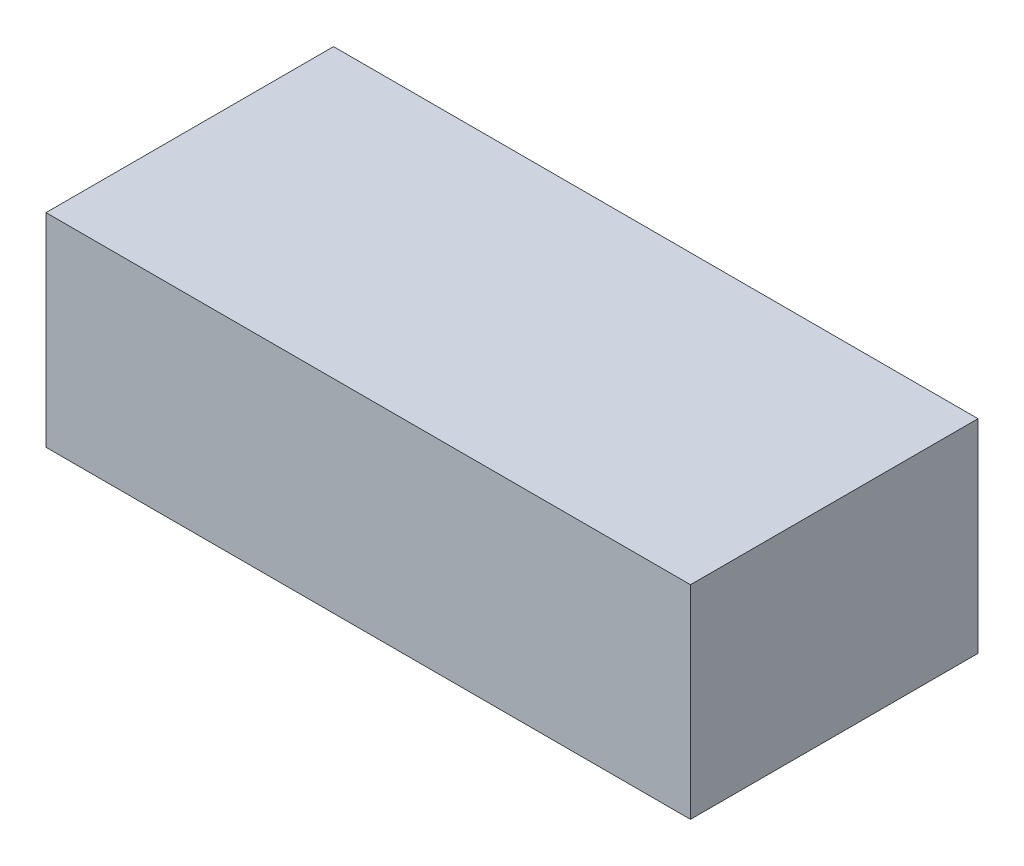
ISO-10303-21;
HEADER;
FILE_DESCRIPTION(('STEP AP214'),'2;1');
FILE_NAME('part.step','',(''),(''),'','','');
FILE_SCHEMA(('AUTOMOTIVE_DESIGN { 1 0 10303 214 1 1 1 1 }'));
ENDSEC;
DATA;
#1=APPLICATION_CONTEXT('core data for automotive mechanical design processes');
#2=APPLICATION_PROTOCOL_DEFINITION('international standard','automotive_design',2000,#1);
#3=PRODUCT_CONTEXT('',#1,'mechanical');
#4=PRODUCT('Part','Part','',(#3));
#5=PRODUCT_RELATED_PRODUCT_CATEGORY('part','',(#4));
#6=PRODUCT_DEFINITION_FORMATION('','',#4);
#7=PRODUCT_DEFINITION_CONTEXT('part definition',#1,'design');
#8=PRODUCT_DEFINITION('design','',#6,#7);
#9=PRODUCT_DEFINITION_SHAPE('','',#8);
#10=(LENGTH_UNIT() NAMED_UNIT(*) SI_UNIT(.MILLI.,.METRE.));
#11=(NAMED_UNIT(*) PLANE_ANGLE_UNIT() SI_UNIT($,.RADIAN.));
#12=(NAMED_UNIT(*) SI_UNIT($,.STERADIAN.) SOLID_ANGLE_UNIT());
#13=UNCERTAINTY_MEASURE_WITH_UNIT(LENGTH_MEASURE(1.E-05),#10,'distance_accuracy_value','');
#14=(GEOMETRIC_REPRESENTATION_CONTEXT(3) GLOBAL_UNCERTAINTY_ASSIGNED_CONTEXT((#13)) GLOBAL_UNIT_ASSIGNED_CONTEXT((#10,
#11,#12)) REPRESENTATION_CONTEXT('',''));
#15=CARTESIAN_POINT('',(0.,0.,0.));
#16=DIRECTION('',(0.,0.,1.));
#17=DIRECTION('',(1.,0.,0.));
#18=AXIS2_PLACEMENT_3D('',#15,#16,#17);
#19=CARTESIAN_POINT('',(32.5,20.5,14.5));
#20=DIRECTION('',(-1.,0.,0.));
#21=DIRECTION('',(0.,0.,1.));
#22=AXIS2_PLACEMENT_3D('',#19,#20,#21);
#23=PLANE('',#22);
#24=DIRECTION('',(0.,0.,-1.));
#25=VECTOR('',#24,1.);
#26=CARTESIAN_POINT('',(32.5,0.,14.5));
#27=LINE('',#26,#25);
#28=CARTESIAN_POINT('',(32.5,0.,14.5));
#29=VERTEX_POINT('',#28);
#30=CARTESIAN_POINT('',(32.5,0.,-14.5));
#31=VERTEX_POINT('',#30);
#32=EDGE_CURVE('E98',#29,#31,#27,.T.);
#33=ORIENTED_EDGE('',*,*,#32,.T.);
#34=DIRECTION('',(0.,-1.,0.));
#35=VECTOR('',#34,1.);
#36=CARTESIAN_POINT('',(32.5,20.5,-14.5));
#37=LINE('',#36,#35);
#38=CARTESIAN_POINT('',(32.5,20.5,-14.5));
#39=VERTEX_POINT('',#38);
#40=EDGE_CURVE('E11',#39,#31,#37,.T.);
#41=ORIENTED_EDGE('',*,*,#40,.F.);
#42=DIRECTION('',(0.,0.,-1.));
#43=VECTOR('',#42,1.);
#44=CARTESIAN_POINT('',(32.5,20.5,14.5));
#45=LINE('',#44,#43);
#46=CARTESIAN_POINT('',(32.5,20.5,14.5));
#47=VERTEX_POINT('',#46);
#48=EDGE_CURVE('E86',#47,#39,#45,.T.);
#49=ORIENTED_EDGE('',*,*,#48,.F.);
#50=DIRECTION('',(0.,-1.,0.));
#51=VECTOR('',#50,1.);
#52=CARTESIAN_POINT('',(32.5,20.5,14.5));
#53=LINE('',#52,#51);
#54=EDGE_CURVE('E94',#47,#29,#53,.T.);
#55=ORIENTED_EDGE('',*,*,#54,.T.);
#56=EDGE_LOOP('',(#33,#41,#49,#55));
#57=FACE_BOUND('',#56,.T.);
#58=ADVANCED_FACE('F35',(#57),#23,.F.);
#59=CARTESIAN_POINT('',(-32.5,20.5,-14.5));
#60=DIRECTION('',(0.,0.,1.));
#61=DIRECTION('',(1.,0.,0.));
#62=AXIS2_PLACEMENT_3D('',#59,#60,#61);
#63=PLANE('',#62);
#64=DIRECTION('',(-1.,0.,0.));
#65=VECTOR('',#64,1.);
#66=CARTESIAN_POINT('',(-32.5,0.,-14.5));
#67=LINE('',#66,#65);
#68=CARTESIAN_POINT('',(-32.5,0.,-14.5));
#69=VERTEX_POINT('',#68);
#70=EDGE_CURVE('E90',#31,#69,#67,.T.);
#71=ORIENTED_EDGE('',*,*,#70,.T.);
#72=DIRECTION('',(0.,-1.,0.));
#73=VECTOR('',#72,1.);
#74=CARTESIAN_POINT('',(-32.5,20.5,-14.5));
#75=LINE('',#74,#73);
#76=CARTESIAN_POINT('',(-32.5,20.5,-14.5));
#77=VERTEX_POINT('',#76);
#78=EDGE_CURVE('E43',#77,#69,#75,.T.);
#79=ORIENTED_EDGE('',*,*,#78,.F.);
#80=DIRECTION('',(-1.,0.,0.));
#81=VECTOR('',#80,1.);
#82=CARTESIAN_POINT('',(-32.5,20.5,-14.5));
#83=LINE('',#82,#81);
#84=EDGE_CURVE('E81',#39,#77,#83,.T.);
#85=ORIENTED_EDGE('',*,*,#84,.F.);
#86=ORIENTED_EDGE('',*,*,#40,.T.);
#87=EDGE_LOOP('',(#71,#79,#85,#86));
#88=FACE_BOUND('',#87,.T.);
#89=ADVANCED_FACE('F89',(#88),#63,.F.);
#90=CARTESIAN_POINT('',(-32.5,20.5,14.5));
#91=DIRECTION('',(1.,0.,0.));
#92=DIRECTION('',(0.,0.,-1.));
#93=AXIS2_PLACEMENT_3D('',#90,#91,#92);
#94=PLANE('',#93);
#95=DIRECTION('',(0.,0.,1.));
#96=VECTOR('',#95,1.);
#97=CARTESIAN_POINT('',(-32.5,0.,14.5));
#98=LINE('',#97,#96);
#99=CARTESIAN_POINT('',(-32.5,0.,14.5));
#100=VERTEX_POINT('',#99);
#101=EDGE_CURVE('E68',#69,#100,#98,.T.);
#102=ORIENTED_EDGE('',*,*,#101,.T.);
#103=DIRECTION('',(0.,-1.,0.));
#104=VECTOR('',#103,1.);
#105=CARTESIAN_POINT('',(-32.5,20.5,14.5));
#106=LINE('',#105,#104);
#107=CARTESIAN_POINT('',(-32.5,20.5,14.5));
#108=VERTEX_POINT('',#107);
#109=EDGE_CURVE('E91',#108,#100,#106,.T.);
#110=ORIENTED_EDGE('',*,*,#109,.F.);
#111=DIRECTION('',(0.,0.,1.));
#112=VECTOR('',#111,1.);
#113=CARTESIAN_POINT('',(-32.5,20.5,14.5));
#114=LINE('',#113,#112);
#115=EDGE_CURVE('E84',#77,#108,#114,.T.);
#116=ORIENTED_EDGE('',*,*,#115,.F.);
#117=ORIENTED_EDGE('',*,*,#78,.T.);
#118=EDGE_LOOP('',(#102,#110,#116,#117));
#119=FACE_BOUND('',#118,.T.);
#120=ADVANCED_FACE('F92',(#119),#94,.F.);
#121=CARTESIAN_POINT('',(-32.5,20.5,14.5));
#122=DIRECTION('',(0.,0.,-1.));
#123=DIRECTION('',(-1.,0.,0.));
#124=AXIS2_PLACEMENT_3D('',#121,#122,#123);
#125=PLANE('',#124);
#126=DIRECTION('',(1.,0.,0.));
#127=VECTOR('',#126,1.);
#128=CARTESIAN_POINT('',(-32.5,0.,14.5));
#129=LINE('',#128,#127);
#130=EDGE_CURVE('E74',#100,#29,#129,.T.);
#131=ORIENTED_EDGE('',*,*,#130,.T.);
#132=ORIENTED_EDGE('',*,*,#54,.F.);
#133=DIRECTION('',(1.,0.,0.));
#134=VECTOR('',#133,1.);
#135=CARTESIAN_POINT('',(-32.5,20.5,14.5));
#136=LINE('',#135,#134);
#137=EDGE_CURVE('E51',#108,#47,#136,.T.);
#138=ORIENTED_EDGE('',*,*,#137,.F.);
#139=ORIENTED_EDGE('',*,*,#109,.T.);
#140=EDGE_LOOP('',(#131,#132,#138,#139));
#141=FACE_BOUND('',#140,.T.);
#142=ADVANCED_FACE('F105',(#141),#125,.F.);
#143=CARTESIAN_POINT('',(0.,20.5,0.));
#144=DIRECTION('',(0.,-1.,0.));
#145=DIRECTION('',(0.,0.,-1.));
#146=AXIS2_PLACEMENT_3D('',#143,#144,#145);
#147=PLANE('',#146);
#148=ORIENTED_EDGE('',*,*,#48,.T.);
#149=ORIENTED_EDGE('',*,*,#84,.T.);
#150=ORIENTED_EDGE('',*,*,#115,.T.);
#151=ORIENTED_EDGE('',*,*,#137,.T.);
#152=EDGE_LOOP('',(#148,#149,#150,#151));
#153=FACE_BOUND('',#152,.T.);
#154=ADVANCED_FACE('F82',(#153),#147,.F.);
#155=CARTESIAN_POINT('',(0.,0.,0.));
#156=DIRECTION('',(0.,-1.,0.));
#157=DIRECTION('',(0.,0.,-1.));
#158=AXIS2_PLACEMENT_3D('',#155,#156,#157);
#159=PLANE('',#158);
#160=ORIENTED_EDGE('',*,*,#32,.F.);
#161=ORIENTED_EDGE('',*,*,#130,.F.);
#162=ORIENTED_EDGE('',*,*,#101,.F.);
#163=ORIENTED_EDGE('',*,*,#70,.F.);
#164=EDGE_LOOP('',(#160,#161,#162,#163));
#165=FACE_BOUND('',#164,.T.);
#166=ADVANCED_FACE('F108',(#165),#159,.T.);
#167=CLOSED_SHELL('',(#58,#89,#120,#142,#154,#166));
#168=MANIFOLD_SOLID_BREP('B2',#167);
#169=ADVANCED_BREP_SHAPE_REPRESENTATION('',(#18,#168),#14);
#170=SHAPE_DEFINITION_REPRESENTATION(#9,#169);
ENDSEC;
END-ISO-10303-21;
